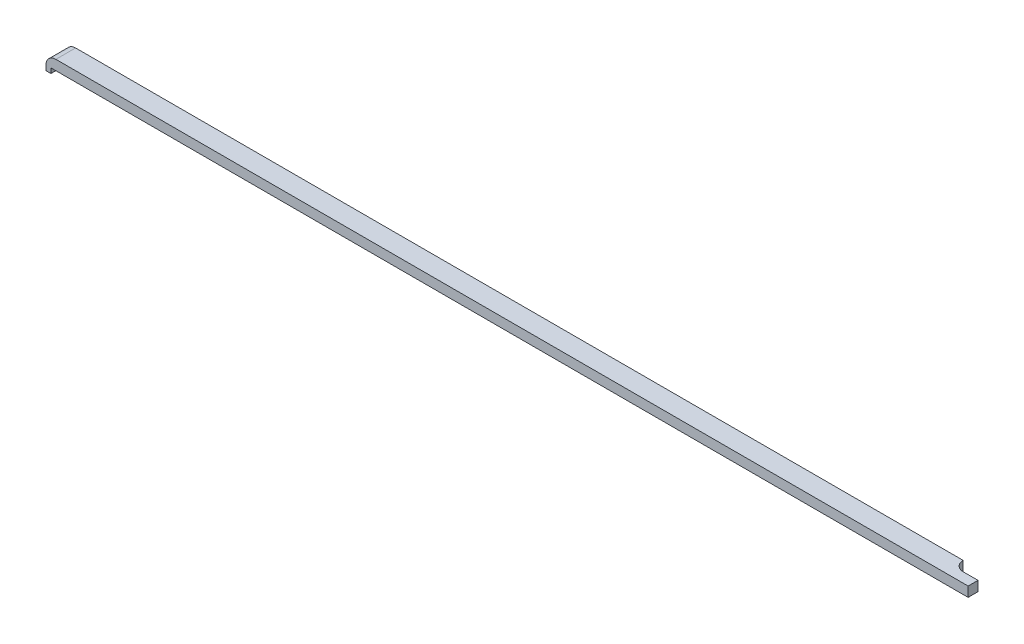
ISO-10303-21;
HEADER;
FILE_DESCRIPTION(('STEP AP214'),'2;1');
FILE_NAME('part.step','',(''),(''),'','','');
FILE_SCHEMA(('AUTOMOTIVE_DESIGN { 1 0 10303 214 1 1 1 1 }'));
ENDSEC;
DATA;
#1=APPLICATION_CONTEXT('core data for automotive mechanical design processes');
#2=APPLICATION_PROTOCOL_DEFINITION('international standard','automotive_design',2000,#1);
#3=PRODUCT_CONTEXT('',#1,'mechanical');
#4=PRODUCT('Part','Part','',(#3));
#5=PRODUCT_RELATED_PRODUCT_CATEGORY('part','',(#4));
#6=PRODUCT_DEFINITION_FORMATION('','',#4);
#7=PRODUCT_DEFINITION_CONTEXT('part definition',#1,'design');
#8=PRODUCT_DEFINITION('design','',#6,#7);
#9=PRODUCT_DEFINITION_SHAPE('','',#8);
#10=(LENGTH_UNIT() NAMED_UNIT(*) SI_UNIT(.MILLI.,.METRE.));
#11=(NAMED_UNIT(*) PLANE_ANGLE_UNIT() SI_UNIT($,.RADIAN.));
#12=(NAMED_UNIT(*) SI_UNIT($,.STERADIAN.) SOLID_ANGLE_UNIT());
#13=UNCERTAINTY_MEASURE_WITH_UNIT(LENGTH_MEASURE(1.E-05),#10,'distance_accuracy_value','');
#14=(GEOMETRIC_REPRESENTATION_CONTEXT(3) GLOBAL_UNCERTAINTY_ASSIGNED_CONTEXT((#13)) GLOBAL_UNIT_ASSIGNED_CONTEXT((#10,
#11,#12)) REPRESENTATION_CONTEXT('',''));
#15=CARTESIAN_POINT('',(0.,0.,0.));
#16=DIRECTION('',(0.,0.,1.));
#17=DIRECTION('',(1.,0.,0.));
#18=AXIS2_PLACEMENT_3D('',#15,#16,#17);
#19=CARTESIAN_POINT('',(0.,-2.,4.));
#20=DIRECTION('',(0.,1.,0.));
#21=DIRECTION('',(0.,0.,1.));
#22=AXIS2_PLACEMENT_3D('',#19,#20,#21);
#23=PLANE('',#22);
#24=DIRECTION('',(1.,0.,0.));
#25=VECTOR('',#24,1.);
#26=CARTESIAN_POINT('',(0.,-2.,0.));
#27=LINE('',#26,#25);
#28=CARTESIAN_POINT('',(1.,-2.,0.));
#29=VERTEX_POINT('',#28);
#30=CARTESIAN_POINT('',(182.,-2.,0.));
#31=VERTEX_POINT('',#30);
#32=EDGE_CURVE('E189',#29,#31,#27,.T.);
#33=ORIENTED_EDGE('',*,*,#32,.T.);
#34=CARTESIAN_POINT('',(184.,-2.,0.));
#35=DIRECTION('',(0.,1.,0.));
#36=DIRECTION('',(0.,0.,1.));
#37=AXIS2_PLACEMENT_3D('',#34,#35,#36);
#38=CIRCLE('',#37,2.);
#39=CARTESIAN_POINT('',(184.,-2.,2.));
#40=VERTEX_POINT('',#39);
#41=EDGE_CURVE('E54',#31,#40,#38,.T.);
#42=ORIENTED_EDGE('',*,*,#41,.T.);
#43=DIRECTION('',(-1.,0.,0.));
#44=VECTOR('',#43,1.);
#45=CARTESIAN_POINT('',(187.,-2.,2.));
#46=LINE('',#45,#44);
#47=CARTESIAN_POINT('',(187.,-2.,2.));
#48=VERTEX_POINT('',#47);
#49=EDGE_CURVE('E121',#48,#40,#46,.T.);
#50=ORIENTED_EDGE('',*,*,#49,.F.);
#51=DIRECTION('',(0.,0.,-1.));
#52=VECTOR('',#51,1.);
#53=CARTESIAN_POINT('',(187.,-2.,4.));
#54=LINE('',#53,#52);
#55=CARTESIAN_POINT('',(187.,-2.,4.));
#56=VERTEX_POINT('',#55);
#57=EDGE_CURVE('E131',#56,#48,#54,.T.);
#58=ORIENTED_EDGE('',*,*,#57,.F.);
#59=DIRECTION('',(1.,0.,0.));
#60=VECTOR('',#59,1.);
#61=CARTESIAN_POINT('',(0.,-2.,4.));
#62=LINE('',#61,#60);
#63=CARTESIAN_POINT('',(1.,-2.,4.));
#64=VERTEX_POINT('',#63);
#65=EDGE_CURVE('E192',#64,#56,#62,.T.);
#66=ORIENTED_EDGE('',*,*,#65,.F.);
#67=DIRECTION('',(0.,0.,1.));
#68=VECTOR('',#67,1.);
#69=CARTESIAN_POINT('',(1.,-2.,4.));
#70=LINE('',#69,#68);
#71=EDGE_CURVE('E211',#29,#64,#70,.T.);
#72=ORIENTED_EDGE('',*,*,#71,.F.);
#73=EDGE_LOOP('',(#33,#42,#50,#58,#66,#72));
#74=FACE_BOUND('',#73,.T.);
#75=ADVANCED_FACE('F45',(#74),#23,.F.);
#76=CARTESIAN_POINT('',(187.,0.,4.));
#77=DIRECTION('',(1.,0.,0.));
#78=DIRECTION('',(0.,0.,-1.));
#79=AXIS2_PLACEMENT_3D('',#76,#77,#78);
#80=PLANE('',#79);
#81=DIRECTION('',(0.,-1.,0.));
#82=VECTOR('',#81,1.);
#83=CARTESIAN_POINT('',(187.,0.,2.));
#84=LINE('',#83,#82);
#85=CARTESIAN_POINT('',(187.,0.,2.));
#86=VERTEX_POINT('',#85);
#87=EDGE_CURVE('E116',#86,#48,#84,.T.);
#88=ORIENTED_EDGE('',*,*,#87,.F.);
#89=DIRECTION('',(0.,0.,-1.));
#90=VECTOR('',#89,1.);
#91=CARTESIAN_POINT('',(187.,0.,4.));
#92=LINE('',#91,#90);
#93=CARTESIAN_POINT('',(187.,0.,4.));
#94=VERTEX_POINT('',#93);
#95=EDGE_CURVE('E128',#94,#86,#92,.T.);
#96=ORIENTED_EDGE('',*,*,#95,.F.);
#97=DIRECTION('',(0.,-1.,0.));
#98=VECTOR('',#97,1.);
#99=CARTESIAN_POINT('',(187.,0.,4.));
#100=LINE('',#99,#98);
#101=EDGE_CURVE('E198',#94,#56,#100,.T.);
#102=ORIENTED_EDGE('',*,*,#101,.T.);
#103=ORIENTED_EDGE('',*,*,#57,.T.);
#104=EDGE_LOOP('',(#88,#96,#102,#103));
#105=FACE_BOUND('',#104,.T.);
#106=ADVANCED_FACE('F126',(#105),#80,.T.);
#107=CARTESIAN_POINT('',(0.,0.,4.));
#108=DIRECTION('',(0.,1.,0.));
#109=DIRECTION('',(0.,0.,1.));
#110=AXIS2_PLACEMENT_3D('',#107,#108,#109);
#111=PLANE('',#110);
#112=DIRECTION('',(-1.,0.,0.));
#113=VECTOR('',#112,1.);
#114=CARTESIAN_POINT('',(187.,0.,2.));
#115=LINE('',#114,#113);
#116=CARTESIAN_POINT('',(184.,0.,2.));
#117=VERTEX_POINT('',#116);
#118=EDGE_CURVE('E113',#86,#117,#115,.T.);
#119=ORIENTED_EDGE('',*,*,#118,.T.);
#120=CARTESIAN_POINT('',(184.,0.,0.));
#121=DIRECTION('',(0.,1.,0.));
#122=DIRECTION('',(0.,0.,1.));
#123=AXIS2_PLACEMENT_3D('',#120,#121,#122);
#124=CIRCLE('',#123,2.);
#125=CARTESIAN_POINT('',(182.,0.,0.));
#126=VERTEX_POINT('',#125);
#127=EDGE_CURVE('E11',#117,#126,#124,.F.);
#128=ORIENTED_EDGE('',*,*,#127,.T.);
#129=DIRECTION('',(1.,0.,0.));
#130=VECTOR('',#129,1.);
#131=CARTESIAN_POINT('',(0.,0.,0.));
#132=LINE('',#131,#130);
#133=CARTESIAN_POINT('',(2.,0.,0.));
#134=VERTEX_POINT('',#133);
#135=EDGE_CURVE('E185',#134,#126,#132,.T.);
#136=ORIENTED_EDGE('',*,*,#135,.F.);
#137=DIRECTION('',(0.,0.,-1.));
#138=VECTOR('',#137,1.);
#139=CARTESIAN_POINT('',(2.,0.,4.));
#140=LINE('',#139,#138);
#141=CARTESIAN_POINT('',(2.,0.,4.));
#142=VERTEX_POINT('',#141);
#143=EDGE_CURVE('E157',#134,#142,#140,.F.);
#144=ORIENTED_EDGE('',*,*,#143,.T.);
#145=DIRECTION('',(1.,0.,0.));
#146=VECTOR('',#145,1.);
#147=CARTESIAN_POINT('',(0.,0.,4.));
#148=LINE('',#147,#146);
#149=EDGE_CURVE('E137',#142,#94,#148,.T.);
#150=ORIENTED_EDGE('',*,*,#149,.T.);
#151=ORIENTED_EDGE('',*,*,#95,.T.);
#152=EDGE_LOOP('',(#119,#128,#136,#144,#150,#151));
#153=FACE_BOUND('',#152,.T.);
#154=ADVANCED_FACE('F135',(#153),#111,.T.);
#155=CARTESIAN_POINT('',(0.,-2.,4.));
#156=DIRECTION('',(-1.,0.,0.));
#157=DIRECTION('',(0.,0.,1.));
#158=AXIS2_PLACEMENT_3D('',#155,#156,#157);
#159=PLANE('',#158);
#160=DIRECTION('',(0.,1.,0.));
#161=VECTOR('',#160,1.);
#162=CARTESIAN_POINT('',(0.,-2.,4.));
#163=LINE('',#162,#161);
#164=CARTESIAN_POINT('',(0.,-3.,4.));
#165=VERTEX_POINT('',#164);
#166=CARTESIAN_POINT('',(0.,-2.,4.));
#167=VERTEX_POINT('',#166);
#168=EDGE_CURVE('E139',#165,#167,#163,.T.);
#169=ORIENTED_EDGE('',*,*,#168,.T.);
#170=DIRECTION('',(0.,0.,-1.));
#171=VECTOR('',#170,1.);
#172=CARTESIAN_POINT('',(0.,-2.,4.));
#173=LINE('',#172,#171);
#174=CARTESIAN_POINT('',(0.,-2.,0.));
#175=VERTEX_POINT('',#174);
#176=EDGE_CURVE('E143',#167,#175,#173,.T.);
#177=ORIENTED_EDGE('',*,*,#176,.T.);
#178=DIRECTION('',(0.,1.,0.));
#179=VECTOR('',#178,1.);
#180=CARTESIAN_POINT('',(0.,-2.,0.));
#181=LINE('',#180,#179);
#182=CARTESIAN_POINT('',(0.,-3.,0.));
#183=VERTEX_POINT('',#182);
#184=EDGE_CURVE('E148',#183,#175,#181,.T.);
#185=ORIENTED_EDGE('',*,*,#184,.F.);
#186=DIRECTION('',(0.,0.,-1.));
#187=VECTOR('',#186,1.);
#188=CARTESIAN_POINT('',(0.,-3.,4.));
#189=LINE('',#188,#187);
#190=EDGE_CURVE('E178',#165,#183,#189,.T.);
#191=ORIENTED_EDGE('',*,*,#190,.F.);
#192=EDGE_LOOP('',(#169,#177,#185,#191));
#193=FACE_BOUND('',#192,.T.);
#194=ADVANCED_FACE('F175',(#193),#159,.T.);
#195=CARTESIAN_POINT('',(0.,0.,4.));
#196=DIRECTION('',(0.,0.,-1.));
#197=DIRECTION('',(-1.,0.,0.));
#198=AXIS2_PLACEMENT_3D('',#195,#196,#197);
#199=PLANE('',#198);
#200=ORIENTED_EDGE('',*,*,#149,.F.);
#201=CARTESIAN_POINT('',(2.,-2.,4.));
#202=DIRECTION('',(0.,0.,-1.));
#203=DIRECTION('',(-1.,0.,0.));
#204=AXIS2_PLACEMENT_3D('',#201,#202,#203);
#205=CIRCLE('',#204,2.);
#206=EDGE_CURVE('E160',#142,#167,#205,.F.);
#207=ORIENTED_EDGE('',*,*,#206,.T.);
#208=ORIENTED_EDGE('',*,*,#168,.F.);
#209=DIRECTION('',(-1.,0.,0.));
#210=VECTOR('',#209,1.);
#211=CARTESIAN_POINT('',(0.,-3.,4.));
#212=LINE('',#211,#210);
#213=CARTESIAN_POINT('',(1.,-3.,4.));
#214=VERTEX_POINT('',#213);
#215=EDGE_CURVE('E210',#214,#165,#212,.T.);
#216=ORIENTED_EDGE('',*,*,#215,.F.);
#217=DIRECTION('',(0.,1.,0.));
#218=VECTOR('',#217,1.);
#219=CARTESIAN_POINT('',(1.,-3.,4.));
#220=LINE('',#219,#218);
#221=EDGE_CURVE('E206',#214,#64,#220,.T.);
#222=ORIENTED_EDGE('',*,*,#221,.T.);
#223=ORIENTED_EDGE('',*,*,#65,.T.);
#224=ORIENTED_EDGE('',*,*,#101,.F.);
#225=EDGE_LOOP('',(#200,#207,#208,#216,#222,#223,#224));
#226=FACE_BOUND('',#225,.T.);
#227=ADVANCED_FACE('F167',(#226),#199,.F.);
#228=CARTESIAN_POINT('',(0.,0.,0.));
#229=DIRECTION('',(0.,0.,-1.));
#230=DIRECTION('',(-1.,0.,0.));
#231=AXIS2_PLACEMENT_3D('',#228,#229,#230);
#232=PLANE('',#231);
#233=DIRECTION('',(0.,-1.,0.));
#234=VECTOR('',#233,1.);
#235=CARTESIAN_POINT('',(182.,0.,0.));
#236=LINE('',#235,#234);
#237=EDGE_CURVE('E133',#126,#31,#236,.T.);
#238=ORIENTED_EDGE('',*,*,#237,.T.);
#239=ORIENTED_EDGE('',*,*,#32,.F.);
#240=DIRECTION('',(0.,1.,0.));
#241=VECTOR('',#240,1.);
#242=CARTESIAN_POINT('',(1.,-3.,0.));
#243=LINE('',#242,#241);
#244=CARTESIAN_POINT('',(1.,-3.,0.));
#245=VERTEX_POINT('',#244);
#246=EDGE_CURVE('E193',#245,#29,#243,.T.);
#247=ORIENTED_EDGE('',*,*,#246,.F.);
#248=DIRECTION('',(1.,0.,0.));
#249=VECTOR('',#248,1.);
#250=CARTESIAN_POINT('',(0.,-3.,0.));
#251=LINE('',#250,#249);
#252=EDGE_CURVE('E220',#183,#245,#251,.T.);
#253=ORIENTED_EDGE('',*,*,#252,.F.);
#254=ORIENTED_EDGE('',*,*,#184,.T.);
#255=CARTESIAN_POINT('',(2.,-2.,0.));
#256=DIRECTION('',(0.,0.,-1.));
#257=DIRECTION('',(-1.,0.,0.));
#258=AXIS2_PLACEMENT_3D('',#255,#256,#257);
#259=CIRCLE('',#258,2.);
#260=EDGE_CURVE('E154',#175,#134,#259,.T.);
#261=ORIENTED_EDGE('',*,*,#260,.T.);
#262=ORIENTED_EDGE('',*,*,#135,.T.);
#263=EDGE_LOOP('',(#238,#239,#247,#253,#254,#261,#262));
#264=FACE_BOUND('',#263,.T.);
#265=ADVANCED_FACE('F184',(#264),#232,.T.);
#266=CARTESIAN_POINT('',(1.,-3.,4.));
#267=DIRECTION('',(-1.,0.,0.));
#268=DIRECTION('',(0.,0.,1.));
#269=AXIS2_PLACEMENT_3D('',#266,#267,#268);
#270=PLANE('',#269);
#271=ORIENTED_EDGE('',*,*,#71,.T.);
#272=ORIENTED_EDGE('',*,*,#221,.F.);
#273=DIRECTION('',(0.,0.,1.));
#274=VECTOR('',#273,1.);
#275=CARTESIAN_POINT('',(1.,-3.,4.));
#276=LINE('',#275,#274);
#277=EDGE_CURVE('E217',#245,#214,#276,.T.);
#278=ORIENTED_EDGE('',*,*,#277,.F.);
#279=ORIENTED_EDGE('',*,*,#246,.T.);
#280=EDGE_LOOP('',(#271,#272,#278,#279));
#281=FACE_BOUND('',#280,.T.);
#282=ADVANCED_FACE('F233',(#281),#270,.F.);
#283=CARTESIAN_POINT('',(0.,-3.,0.));
#284=DIRECTION('',(0.,-1.,0.));
#285=DIRECTION('',(0.,0.,-1.));
#286=AXIS2_PLACEMENT_3D('',#283,#284,#285);
#287=PLANE('',#286);
#288=ORIENTED_EDGE('',*,*,#190,.T.);
#289=ORIENTED_EDGE('',*,*,#252,.T.);
#290=ORIENTED_EDGE('',*,*,#277,.T.);
#291=ORIENTED_EDGE('',*,*,#215,.T.);
#292=EDGE_LOOP('',(#288,#289,#290,#291));
#293=FACE_BOUND('',#292,.T.);
#294=ADVANCED_FACE('F236',(#293),#287,.T.);
#295=CARTESIAN_POINT('',(2.,-2.,4.));
#296=DIRECTION('',(0.,0.,-1.));
#297=DIRECTION('',(-1.,0.,0.));
#298=AXIS2_PLACEMENT_3D('',#295,#296,#297);
#299=CYLINDRICAL_SURFACE('',#298,2.);
#300=ORIENTED_EDGE('',*,*,#206,.F.);
#301=ORIENTED_EDGE('',*,*,#143,.F.);
#302=ORIENTED_EDGE('',*,*,#260,.F.);
#303=ORIENTED_EDGE('',*,*,#176,.F.);
#304=EDGE_LOOP('',(#300,#301,#302,#303));
#305=FACE_BOUND('',#304,.T.);
#306=ADVANCED_FACE('F179',(#305),#299,.T.);
#307=CARTESIAN_POINT('',(187.,0.,2.));
#308=DIRECTION('',(0.,0.,1.));
#309=DIRECTION('',(1.,0.,0.));
#310=AXIS2_PLACEMENT_3D('',#307,#308,#309);
#311=PLANE('',#310);
#312=ORIENTED_EDGE('',*,*,#49,.T.);
#313=DIRECTION('',(0.,-1.,0.));
#314=VECTOR('',#313,1.);
#315=CARTESIAN_POINT('',(184.,0.,2.));
#316=LINE('',#315,#314);
#317=EDGE_CURVE('E61',#40,#117,#316,.F.);
#318=ORIENTED_EDGE('',*,*,#317,.T.);
#319=ORIENTED_EDGE('',*,*,#118,.F.);
#320=ORIENTED_EDGE('',*,*,#87,.T.);
#321=EDGE_LOOP('',(#312,#318,#319,#320));
#322=FACE_BOUND('',#321,.T.);
#323=ADVANCED_FACE('F115',(#322),#311,.F.);
#324=CARTESIAN_POINT('',(184.,0.,0.));
#325=DIRECTION('',(0.,1.,0.));
#326=DIRECTION('',(0.,0.,1.));
#327=AXIS2_PLACEMENT_3D('',#324,#325,#326);
#328=CYLINDRICAL_SURFACE('',#327,2.);
#329=ORIENTED_EDGE('',*,*,#127,.F.);
#330=ORIENTED_EDGE('',*,*,#317,.F.);
#331=ORIENTED_EDGE('',*,*,#41,.F.);
#332=ORIENTED_EDGE('',*,*,#237,.F.);
#333=EDGE_LOOP('',(#329,#330,#331,#332));
#334=FACE_BOUND('',#333,.T.);
#335=ADVANCED_FACE('F47',(#334),#328,.F.);
#336=CLOSED_SHELL('',(#75,#106,#154,#194,#227,#265,#282,#294,#306,#323,#335));
#337=MANIFOLD_SOLID_BREP('B2',#336);
#338=ADVANCED_BREP_SHAPE_REPRESENTATION('',(#18,#337),#14);
#339=SHAPE_DEFINITION_REPRESENTATION(#9,#338);
ENDSEC;
END-ISO-10303-21;
